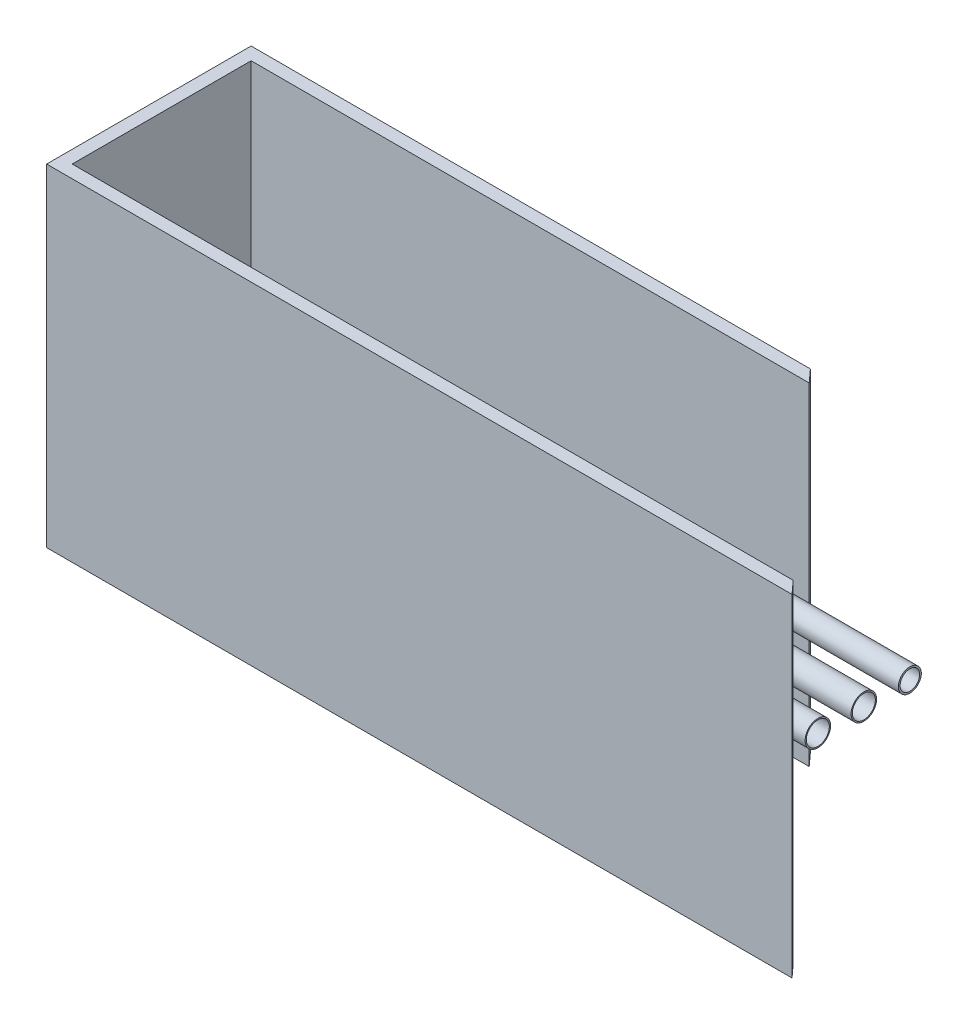
ISO-10303-21;
HEADER;
FILE_DESCRIPTION(('STEP AP214'),'2;1');
FILE_NAME('part.step','',(''),(''),'','','');
FILE_SCHEMA(('AUTOMOTIVE_DESIGN { 1 0 10303 214 1 1 1 1 }'));
ENDSEC;
DATA;
#1=APPLICATION_CONTEXT('core data for automotive mechanical design processes');
#2=APPLICATION_PROTOCOL_DEFINITION('international standard','automotive_design',2000,#1);
#3=PRODUCT_CONTEXT('',#1,'mechanical');
#4=PRODUCT('Part','Part','',(#3));
#5=PRODUCT_RELATED_PRODUCT_CATEGORY('part','',(#4));
#6=PRODUCT_DEFINITION_FORMATION('','',#4);
#7=PRODUCT_DEFINITION_CONTEXT('part definition',#1,'design');
#8=PRODUCT_DEFINITION('design','',#6,#7);
#9=PRODUCT_DEFINITION_SHAPE('','',#8);
#10=(LENGTH_UNIT() NAMED_UNIT(*) SI_UNIT(.MILLI.,.METRE.));
#11=(NAMED_UNIT(*) PLANE_ANGLE_UNIT() SI_UNIT($,.RADIAN.));
#12=(NAMED_UNIT(*) SI_UNIT($,.STERADIAN.) SOLID_ANGLE_UNIT());
#13=UNCERTAINTY_MEASURE_WITH_UNIT(LENGTH_MEASURE(1.E-05),#10,'distance_accuracy_value','');
#14=(GEOMETRIC_REPRESENTATION_CONTEXT(3) GLOBAL_UNCERTAINTY_ASSIGNED_CONTEXT((#13)) GLOBAL_UNIT_ASSIGNED_CONTEXT((#10,
#11,#12)) REPRESENTATION_CONTEXT('',''));
#15=CARTESIAN_POINT('',(0.,0.,0.));
#16=DIRECTION('',(0.,0.,1.));
#17=DIRECTION('',(1.,0.,0.));
#18=AXIS2_PLACEMENT_3D('',#15,#16,#17);
#19=CARTESIAN_POINT('',(-1625.,100.,-350.));
#20=DIRECTION('',(1.,0.,0.));
#21=DIRECTION('',(0.,0.,-1.));
#22=AXIS2_PLACEMENT_3D('',#19,#20,#21);
#23=PLANE('',#22);
#24=CARTESIAN_POINT('',(-1625.,-550.,-10.3175917314073));
#25=DIRECTION('',(1.,0.,0.));
#26=DIRECTION('',(0.,0.,-1.));
#27=AXIS2_PLACEMENT_3D('',#24,#25,#26);
#28=CIRCLE('',#27,49.9275836682249);
#29=CARTESIAN_POINT('',(-1625.,-550.,-60.2451753996322));
#30=VERTEX_POINT('',#29);
#31=EDGE_CURVE('E140',#30,#30,#28,.F.);
#32=ORIENTED_EDGE('',*,*,#31,.T.);
#33=EDGE_LOOP('',(#32));
#34=FACE_BOUND('',#33,.T.);
#35=DIRECTION('',(0.,-1.,0.));
#36=VECTOR('',#35,1.);
#37=CARTESIAN_POINT('',(-1625.,100.,350.));
#38=LINE('',#37,#36);
#39=CARTESIAN_POINT('',(-1625.,100.,350.));
#40=VERTEX_POINT('',#39);
#41=CARTESIAN_POINT('',(-1625.,-1200.,350.));
#42=VERTEX_POINT('',#41);
#43=EDGE_CURVE('E176',#40,#42,#38,.T.);
#44=ORIENTED_EDGE('',*,*,#43,.T.);
#45=DIRECTION('',(0.,0.,1.));
#46=VECTOR('',#45,1.);
#47=CARTESIAN_POINT('',(-1625.,-1200.,-350.));
#48=LINE('',#47,#46);
#49=CARTESIAN_POINT('',(-1625.,-1200.,-350.));
#50=VERTEX_POINT('',#49);
#51=EDGE_CURVE('E150',#50,#42,#48,.T.);
#52=ORIENTED_EDGE('',*,*,#51,.F.);
#53=DIRECTION('',(0.,-1.,0.));
#54=VECTOR('',#53,1.);
#55=CARTESIAN_POINT('',(-1625.,100.,-350.));
#56=LINE('',#55,#54);
#57=CARTESIAN_POINT('',(-1625.,100.,-350.));
#58=VERTEX_POINT('',#57);
#59=EDGE_CURVE('E173',#58,#50,#56,.T.);
#60=ORIENTED_EDGE('',*,*,#59,.F.);
#61=DIRECTION('',(0.,0.,1.));
#62=VECTOR('',#61,1.);
#63=CARTESIAN_POINT('',(-1625.,100.,-350.));
#64=LINE('',#63,#62);
#65=EDGE_CURVE('E166',#58,#40,#64,.T.);
#66=ORIENTED_EDGE('',*,*,#65,.T.);
#67=EDGE_LOOP('',(#44,#52,#60,#66));
#68=FACE_BOUND('',#67,.T.);
#69=CARTESIAN_POINT('',(-1625.,-550.,-190.317591731407));
#70=DIRECTION('',(1.,0.,0.));
#71=DIRECTION('',(0.,0.,-1.));
#72=AXIS2_PLACEMENT_3D('',#69,#70,#71);
#73=CIRCLE('',#72,44.9275836682249);
#74=CARTESIAN_POINT('',(-1625.,-550.,-235.245175399632));
#75=VERTEX_POINT('',#74);
#76=EDGE_CURVE('E192',#75,#75,#73,.F.);
#77=ORIENTED_EDGE('',*,*,#76,.T.);
#78=EDGE_LOOP('',(#77));
#79=FACE_BOUND('',#78,.T.);
#80=CARTESIAN_POINT('',(-1625.,-550.,169.682408268593));
#81=DIRECTION('',(1.,0.,0.));
#82=DIRECTION('',(0.,0.,-1.));
#83=AXIS2_PLACEMENT_3D('',#80,#81,#82);
#84=CIRCLE('',#83,49.9275836682249);
#85=CARTESIAN_POINT('',(-1625.,-550.,119.754824600368));
#86=VERTEX_POINT('',#85);
#87=EDGE_CURVE('E39',#86,#86,#84,.F.);
#88=ORIENTED_EDGE('',*,*,#87,.T.);
#89=EDGE_LOOP('',(#88));
#90=FACE_BOUND('',#89,.T.);
#91=ADVANCED_FACE('F35',(#34,#68,#79,#90),#23,.T.);
#92=CARTESIAN_POINT('',(0.,100.,0.));
#93=DIRECTION('',(0.,1.,0.));
#94=DIRECTION('',(0.,0.,1.));
#95=AXIS2_PLACEMENT_3D('',#92,#93,#94);
#96=PLANE('',#95);
#97=DIRECTION('',(0.673163635467636,0.,0.739493556350558));
#98=VECTOR('',#97,1.);
#99=CARTESIAN_POINT('',(1241.59041612987,100.,400.));
#100=LINE('',#99,#98);
#101=CARTESIAN_POINT('',(513.34754808949,100.,-400.));
#102=VERTEX_POINT('',#101);
#103=CARTESIAN_POINT('',(558.862727342014,100.,-350.));
#104=VERTEX_POINT('',#103);
#105=EDGE_CURVE('E141',#102,#104,#100,.T.);
#106=ORIENTED_EDGE('',*,*,#105,.F.);
#107=DIRECTION('',(-1.,0.,0.));
#108=VECTOR('',#107,1.);
#109=CARTESIAN_POINT('',(-1675.,100.,-400.));
#110=LINE('',#109,#108);
#111=CARTESIAN_POINT('',(-1675.,100.,-400.));
#112=VERTEX_POINT('',#111);
#113=EDGE_CURVE('E178',#102,#112,#110,.T.);
#114=ORIENTED_EDGE('',*,*,#113,.T.);
#115=DIRECTION('',(0.,0.,1.));
#116=VECTOR('',#115,1.);
#117=CARTESIAN_POINT('',(-1675.,100.,-400.));
#118=LINE('',#117,#116);
#119=CARTESIAN_POINT('',(-1675.,100.,400.));
#120=VERTEX_POINT('',#119);
#121=EDGE_CURVE('E180',#112,#120,#118,.T.);
#122=ORIENTED_EDGE('',*,*,#121,.T.);
#123=DIRECTION('',(1.,0.,0.));
#124=VECTOR('',#123,1.);
#125=CARTESIAN_POINT('',(-1675.,100.,400.));
#126=LINE('',#125,#124);
#127=CARTESIAN_POINT('',(1241.59041612987,100.,400.));
#128=VERTEX_POINT('',#127);
#129=EDGE_CURVE('E182',#120,#128,#126,.T.);
#130=ORIENTED_EDGE('',*,*,#129,.T.);
#131=CARTESIAN_POINT('',(1196.07523687734,100.,350.));
#132=VERTEX_POINT('',#131);
#133=EDGE_CURVE('E144',#132,#128,#100,.T.);
#134=ORIENTED_EDGE('',*,*,#133,.F.);
#135=DIRECTION('',(1.,0.,0.));
#136=VECTOR('',#135,1.);
#137=CARTESIAN_POINT('',(-1625.,100.,350.));
#138=LINE('',#137,#136);
#139=EDGE_CURVE('E168',#40,#132,#138,.T.);
#140=ORIENTED_EDGE('',*,*,#139,.F.);
#141=ORIENTED_EDGE('',*,*,#65,.F.);
#142=DIRECTION('',(-1.,0.,0.));
#143=VECTOR('',#142,1.);
#144=CARTESIAN_POINT('',(-1625.,100.,-350.));
#145=LINE('',#144,#143);
#146=EDGE_CURVE('E171',#104,#58,#145,.T.);
#147=ORIENTED_EDGE('',*,*,#146,.F.);
#148=EDGE_LOOP('',(#106,#114,#122,#130,#134,#140,#141,#147));
#149=FACE_BOUND('',#148,.T.);
#150=ADVANCED_FACE('F221',(#149),#96,.T.);
#151=CARTESIAN_POINT('',(-1675.,100.,-400.));
#152=DIRECTION('',(0.,0.,1.));
#153=DIRECTION('',(1.,0.,0.));
#154=AXIS2_PLACEMENT_3D('',#151,#152,#153);
#155=PLANE('',#154);
#156=ORIENTED_EDGE('',*,*,#113,.F.);
#157=DIRECTION('',(0.,1.,0.));
#158=VECTOR('',#157,1.);
#159=CARTESIAN_POINT('',(513.34754808949,-1348.,-400.));
#160=LINE('',#159,#158);
#161=CARTESIAN_POINT('',(513.34754808949,-1200.,-400.));
#162=VERTEX_POINT('',#161);
#163=EDGE_CURVE('E143',#162,#102,#160,.T.);
#164=ORIENTED_EDGE('',*,*,#163,.F.);
#165=DIRECTION('',(-1.,0.,0.));
#166=VECTOR('',#165,1.);
#167=CARTESIAN_POINT('',(-1675.,-1200.,-400.));
#168=LINE('',#167,#166);
#169=CARTESIAN_POINT('',(-1675.,-1200.,-400.));
#170=VERTEX_POINT('',#169);
#171=EDGE_CURVE('E158',#162,#170,#168,.T.);
#172=ORIENTED_EDGE('',*,*,#171,.T.);
#173=DIRECTION('',(0.,-1.,0.));
#174=VECTOR('',#173,1.);
#175=CARTESIAN_POINT('',(-1675.,100.,-400.));
#176=LINE('',#175,#174);
#177=EDGE_CURVE('E187',#112,#170,#176,.T.);
#178=ORIENTED_EDGE('',*,*,#177,.F.);
#179=EDGE_LOOP('',(#156,#164,#172,#178));
#180=FACE_BOUND('',#179,.T.);
#181=ADVANCED_FACE('F37',(#180),#155,.F.);
#182=CARTESIAN_POINT('',(-1675.,100.,-400.));
#183=DIRECTION('',(1.,0.,0.));
#184=DIRECTION('',(0.,0.,-1.));
#185=AXIS2_PLACEMENT_3D('',#182,#183,#184);
#186=PLANE('',#185);
#187=ORIENTED_EDGE('',*,*,#177,.T.);
#188=DIRECTION('',(0.,0.,1.));
#189=VECTOR('',#188,1.);
#190=CARTESIAN_POINT('',(-1675.,-1200.,-400.));
#191=LINE('',#190,#189);
#192=CARTESIAN_POINT('',(-1675.,-1200.,400.));
#193=VERTEX_POINT('',#192);
#194=EDGE_CURVE('E160',#170,#193,#191,.T.);
#195=ORIENTED_EDGE('',*,*,#194,.T.);
#196=DIRECTION('',(0.,-1.,0.));
#197=VECTOR('',#196,1.);
#198=CARTESIAN_POINT('',(-1675.,100.,400.));
#199=LINE('',#198,#197);
#200=EDGE_CURVE('E185',#120,#193,#199,.T.);
#201=ORIENTED_EDGE('',*,*,#200,.F.);
#202=ORIENTED_EDGE('',*,*,#121,.F.);
#203=EDGE_LOOP('',(#187,#195,#201,#202));
#204=FACE_BOUND('',#203,.T.);
#205=ADVANCED_FACE('F280',(#204),#186,.F.);
#206=CARTESIAN_POINT('',(-1675.,100.,400.));
#207=DIRECTION('',(0.,0.,-1.));
#208=DIRECTION('',(-1.,0.,0.));
#209=AXIS2_PLACEMENT_3D('',#206,#207,#208);
#210=PLANE('',#209);
#211=DIRECTION('',(1.,0.,0.));
#212=VECTOR('',#211,1.);
#213=CARTESIAN_POINT('',(-1675.,-1200.,400.));
#214=LINE('',#213,#212);
#215=CARTESIAN_POINT('',(1241.59041612987,-1200.,400.));
#216=VERTEX_POINT('',#215);
#217=EDGE_CURVE('E163',#193,#216,#214,.T.);
#218=ORIENTED_EDGE('',*,*,#217,.T.);
#219=DIRECTION('',(0.,1.,0.));
#220=VECTOR('',#219,1.);
#221=CARTESIAN_POINT('',(1241.59041612987,-1348.,400.));
#222=LINE('',#221,#220);
#223=EDGE_CURVE('E52',#216,#128,#222,.T.);
#224=ORIENTED_EDGE('',*,*,#223,.T.);
#225=ORIENTED_EDGE('',*,*,#129,.F.);
#226=ORIENTED_EDGE('',*,*,#200,.T.);
#227=EDGE_LOOP('',(#218,#224,#225,#226));
#228=FACE_BOUND('',#227,.T.);
#229=ADVANCED_FACE('F275',(#228),#210,.F.);
#230=CARTESIAN_POINT('',(-1625.,100.,350.));
#231=DIRECTION('',(0.,0.,-1.));
#232=DIRECTION('',(-1.,0.,0.));
#233=AXIS2_PLACEMENT_3D('',#230,#231,#232);
#234=PLANE('',#233);
#235=DIRECTION('',(0.,1.,0.));
#236=VECTOR('',#235,1.);
#237=CARTESIAN_POINT('',(1196.07523687734,100.,350.));
#238=LINE('',#237,#236);
#239=CARTESIAN_POINT('',(1196.07523687734,-1200.,350.));
#240=VERTEX_POINT('',#239);
#241=EDGE_CURVE('E146',#240,#132,#238,.T.);
#242=ORIENTED_EDGE('',*,*,#241,.F.);
#243=DIRECTION('',(1.,0.,0.));
#244=VECTOR('',#243,1.);
#245=CARTESIAN_POINT('',(-1625.,-1200.,350.));
#246=LINE('',#245,#244);
#247=EDGE_CURVE('E153',#42,#240,#246,.T.);
#248=ORIENTED_EDGE('',*,*,#247,.F.);
#249=ORIENTED_EDGE('',*,*,#43,.F.);
#250=ORIENTED_EDGE('',*,*,#139,.T.);
#251=EDGE_LOOP('',(#242,#248,#249,#250));
#252=FACE_BOUND('',#251,.T.);
#253=ADVANCED_FACE('F272',(#252),#234,.T.);
#254=CARTESIAN_POINT('',(-1625.,100.,-350.));
#255=DIRECTION('',(0.,0.,1.));
#256=DIRECTION('',(1.,0.,0.));
#257=AXIS2_PLACEMENT_3D('',#254,#255,#256);
#258=PLANE('',#257);
#259=DIRECTION('',(0.,-1.,0.));
#260=VECTOR('',#259,1.);
#261=CARTESIAN_POINT('',(558.862727342014,100.,-350.));
#262=LINE('',#261,#260);
#263=CARTESIAN_POINT('',(558.862727342013,-1200.,-350.));
#264=VERTEX_POINT('',#263);
#265=EDGE_CURVE('E60',#104,#264,#262,.T.);
#266=ORIENTED_EDGE('',*,*,#265,.F.);
#267=ORIENTED_EDGE('',*,*,#146,.T.);
#268=ORIENTED_EDGE('',*,*,#59,.T.);
#269=DIRECTION('',(-1.,0.,0.));
#270=VECTOR('',#269,1.);
#271=CARTESIAN_POINT('',(-1625.,-1200.,-350.));
#272=LINE('',#271,#270);
#273=EDGE_CURVE('E156',#264,#50,#272,.T.);
#274=ORIENTED_EDGE('',*,*,#273,.F.);
#275=EDGE_LOOP('',(#266,#267,#268,#274));
#276=FACE_BOUND('',#275,.T.);
#277=ADVANCED_FACE('F269',(#276),#258,.T.);
#278=CARTESIAN_POINT('',(0.,-1200.,0.));
#279=DIRECTION('',(0.,1.,0.));
#280=DIRECTION('',(0.,0.,1.));
#281=AXIS2_PLACEMENT_3D('',#278,#279,#280);
#282=PLANE('',#281);
#283=ORIENTED_EDGE('',*,*,#171,.F.);
#284=DIRECTION('',(0.673163635467636,0.,0.739493556350558));
#285=VECTOR('',#284,1.);
#286=CARTESIAN_POINT('',(479.844544542555,-1200.,-436.804209163999));
#287=LINE('',#286,#285);
#288=EDGE_CURVE('E11',#162,#264,#287,.T.);
#289=ORIENTED_EDGE('',*,*,#288,.T.);
#290=ORIENTED_EDGE('',*,*,#273,.T.);
#291=ORIENTED_EDGE('',*,*,#51,.T.);
#292=ORIENTED_EDGE('',*,*,#247,.T.);
#293=EDGE_CURVE('E44',#240,#216,#287,.T.);
#294=ORIENTED_EDGE('',*,*,#293,.T.);
#295=ORIENTED_EDGE('',*,*,#217,.F.);
#296=ORIENTED_EDGE('',*,*,#194,.F.);
#297=EDGE_LOOP('',(#283,#289,#290,#291,#292,#294,#295,#296));
#298=FACE_BOUND('',#297,.T.);
#299=ADVANCED_FACE('F266',(#298),#282,.F.);
#300=CARTESIAN_POINT('',(1241.59041612987,-1348.,400.));
#301=DIRECTION('',(-0.739493556350558,0.,0.673163635467636));
#302=DIRECTION('',(0.673163635467636,0.,0.739493556350558));
#303=AXIS2_PLACEMENT_3D('',#300,#301,#302);
#304=PLANE('',#303);
#305=ORIENTED_EDGE('',*,*,#241,.T.);
#306=ORIENTED_EDGE('',*,*,#133,.T.);
#307=ORIENTED_EDGE('',*,*,#223,.F.);
#308=ORIENTED_EDGE('',*,*,#293,.F.);
#309=EDGE_LOOP('',(#305,#306,#307,#308));
#310=FACE_BOUND('',#309,.T.);
#311=ADVANCED_FACE('F260',(#310),#304,.F.);
#312=ORIENTED_EDGE('',*,*,#265,.T.);
#313=ORIENTED_EDGE('',*,*,#288,.F.);
#314=ORIENTED_EDGE('',*,*,#163,.T.);
#315=ORIENTED_EDGE('',*,*,#105,.T.);
#316=EDGE_LOOP('',(#312,#313,#314,#315));
#317=FACE_BOUND('',#316,.T.);
#318=ADVANCED_FACE('F247',(#317),#304,.F.);
#319=CARTESIAN_POINT('',(-1675.,-550.,-190.317591731407));
#320=DIRECTION('',(1.,0.,0.));
#321=DIRECTION('',(0.,1.,0.));
#322=AXIS2_PLACEMENT_3D('',#319,#320,#321);
#323=CYLINDRICAL_SURFACE('',#322,44.9275836682249);
#324=ORIENTED_EDGE('',*,*,#76,.F.);
#325=EDGE_LOOP('',(#324));
#326=FACE_BOUND('',#325,.T.);
#327=CARTESIAN_POINT('',(1112.34168809318,-550.000000000011,-190.317591731407));
#328=DIRECTION('',(-1.,0.,0.));
#329=DIRECTION('',(0.,0.,1.));
#330=AXIS2_PLACEMENT_3D('',#327,#328,#329);
#331=CIRCLE('',#330,44.9275836682249);
#332=CARTESIAN_POINT('',(1112.34168809318,-550.000000000011,-145.390008063182));
#333=VERTEX_POINT('',#332);
#334=EDGE_CURVE('E137',#333,#333,#331,.T.);
#335=ORIENTED_EDGE('',*,*,#334,.T.);
#336=EDGE_LOOP('',(#335));
#337=FACE_BOUND('',#336,.T.);
#338=ADVANCED_FACE('F238',(#326,#337),#323,.T.);
#339=CARTESIAN_POINT('',(1112.34168809318,-550.000000000011,-190.317591731407));
#340=DIRECTION('',(-1.,0.,0.));
#341=DIRECTION('',(0.,0.,1.));
#342=AXIS2_PLACEMENT_3D('',#339,#340,#341);
#343=PLANE('',#342);
#344=CARTESIAN_POINT('',(1112.34168809318,-550.000000000011,-190.317591731407));
#345=DIRECTION('',(-1.,0.,0.));
#346=DIRECTION('',(0.,0.,1.));
#347=AXIS2_PLACEMENT_3D('',#344,#345,#346);
#348=CIRCLE('',#347,38.1);
#349=CARTESIAN_POINT('',(1112.34168809318,-550.000000000011,-152.217591731407));
#350=VERTEX_POINT('',#349);
#351=EDGE_CURVE('E134',#350,#350,#348,.F.);
#352=ORIENTED_EDGE('',*,*,#351,.F.);
#353=EDGE_LOOP('',(#352));
#354=FACE_BOUND('',#353,.T.);
#355=ORIENTED_EDGE('',*,*,#334,.F.);
#356=EDGE_LOOP('',(#355));
#357=FACE_BOUND('',#356,.T.);
#358=ADVANCED_FACE('F244',(#354,#357),#343,.F.);
#359=CARTESIAN_POINT('',(-1675.,-550.,-190.317591731407));
#360=DIRECTION('',(1.,0.,0.));
#361=DIRECTION('',(0.,1.,0.));
#362=AXIS2_PLACEMENT_3D('',#359,#360,#361);
#363=CYLINDRICAL_SURFACE('',#362,38.1);
#364=CARTESIAN_POINT('',(-1625.,-550.,-190.317591731407));
#365=DIRECTION('',(1.,0.,0.));
#366=DIRECTION('',(0.,0.,-1.));
#367=AXIS2_PLACEMENT_3D('',#364,#365,#366);
#368=CIRCLE('',#367,38.1);
#369=CARTESIAN_POINT('',(-1625.,-550.,-228.417591731407));
#370=VERTEX_POINT('',#369);
#371=EDGE_CURVE('E136',#370,#370,#368,.T.);
#372=ORIENTED_EDGE('',*,*,#371,.F.);
#373=EDGE_LOOP('',(#372));
#374=FACE_BOUND('',#373,.T.);
#375=ORIENTED_EDGE('',*,*,#351,.T.);
#376=EDGE_LOOP('',(#375));
#377=FACE_BOUND('',#376,.T.);
#378=ADVANCED_FACE('F236',(#374,#377),#363,.F.);
#379=ORIENTED_EDGE('',*,*,#371,.T.);
#380=EDGE_LOOP('',(#379));
#381=FACE_BOUND('',#380,.T.);
#382=ADVANCED_FACE('F206',(#381),#23,.T.);
#383=CARTESIAN_POINT('',(-1675.,-550.,-10.3175917314073));
#384=DIRECTION('',(1.,0.,0.));
#385=DIRECTION('',(0.,1.,0.));
#386=AXIS2_PLACEMENT_3D('',#383,#384,#385);
#387=CYLINDRICAL_SURFACE('',#386,49.9275836682249);
#388=ORIENTED_EDGE('',*,*,#31,.F.);
#389=EDGE_LOOP('',(#388));
#390=FACE_BOUND('',#389,.T.);
#391=CARTESIAN_POINT('',(1112.34168809318,-550.000000000011,-10.3175917314073));
#392=DIRECTION('',(-1.,0.,0.));
#393=DIRECTION('',(0.,0.,1.));
#394=AXIS2_PLACEMENT_3D('',#391,#392,#393);
#395=CIRCLE('',#394,49.9275836682249);
#396=CARTESIAN_POINT('',(1112.34168809318,-550.000000000011,39.6099919368177));
#397=VERTEX_POINT('',#396);
#398=EDGE_CURVE('E131',#397,#397,#395,.T.);
#399=ORIENTED_EDGE('',*,*,#398,.T.);
#400=EDGE_LOOP('',(#399));
#401=FACE_BOUND('',#400,.T.);
#402=ADVANCED_FACE('F202',(#390,#401),#387,.T.);
#403=CARTESIAN_POINT('',(1112.34168809318,-550.000000000011,-10.3175917314073));
#404=DIRECTION('',(-1.,0.,0.));
#405=DIRECTION('',(0.,0.,1.));
#406=AXIS2_PLACEMENT_3D('',#403,#404,#405);
#407=PLANE('',#406);
#408=CARTESIAN_POINT('',(1112.34168809318,-550.000000000011,-10.3175917314073));
#409=DIRECTION('',(-1.,0.,0.));
#410=DIRECTION('',(0.,0.,1.));
#411=AXIS2_PLACEMENT_3D('',#408,#409,#410);
#412=CIRCLE('',#411,44.9275836682249);
#413=CARTESIAN_POINT('',(1112.34168809318,-550.000000000011,34.6099919368177));
#414=VERTEX_POINT('',#413);
#415=EDGE_CURVE('E128',#414,#414,#412,.F.);
#416=ORIENTED_EDGE('',*,*,#415,.F.);
#417=EDGE_LOOP('',(#416));
#418=FACE_BOUND('',#417,.T.);
#419=ORIENTED_EDGE('',*,*,#398,.F.);
#420=EDGE_LOOP('',(#419));
#421=FACE_BOUND('',#420,.T.);
#422=ADVANCED_FACE('F205',(#418,#421),#407,.F.);
#423=CARTESIAN_POINT('',(-1675.,-550.,-10.3175917314073));
#424=DIRECTION('',(1.,0.,0.));
#425=DIRECTION('',(0.,1.,0.));
#426=AXIS2_PLACEMENT_3D('',#423,#424,#425);
#427=CYLINDRICAL_SURFACE('',#426,44.9275836682249);
#428=CARTESIAN_POINT('',(-1625.,-550.,-10.3175917314073));
#429=DIRECTION('',(1.,0.,0.));
#430=DIRECTION('',(0.,0.,-1.));
#431=AXIS2_PLACEMENT_3D('',#428,#429,#430);
#432=CIRCLE('',#431,44.9275836682249);
#433=CARTESIAN_POINT('',(-1625.,-550.,-55.2451753996322));
#434=VERTEX_POINT('',#433);
#435=EDGE_CURVE('E130',#434,#434,#432,.T.);
#436=ORIENTED_EDGE('',*,*,#435,.F.);
#437=EDGE_LOOP('',(#436));
#438=FACE_BOUND('',#437,.T.);
#439=ORIENTED_EDGE('',*,*,#415,.T.);
#440=EDGE_LOOP('',(#439));
#441=FACE_BOUND('',#440,.T.);
#442=ADVANCED_FACE('F211',(#438,#441),#427,.F.);
#443=ORIENTED_EDGE('',*,*,#435,.T.);
#444=EDGE_LOOP('',(#443));
#445=FACE_BOUND('',#444,.T.);
#446=ADVANCED_FACE('F208',(#445),#23,.T.);
#447=CARTESIAN_POINT('',(-1675.,-550.,169.682408268593));
#448=DIRECTION('',(1.,0.,0.));
#449=DIRECTION('',(0.,1.,0.));
#450=AXIS2_PLACEMENT_3D('',#447,#448,#449);
#451=CYLINDRICAL_SURFACE('',#450,49.9275836682249);
#452=ORIENTED_EDGE('',*,*,#87,.F.);
#453=EDGE_LOOP('',(#452));
#454=FACE_BOUND('',#453,.T.);
#455=CARTESIAN_POINT('',(1112.34168809318,-550.000000000011,169.682408268593));
#456=DIRECTION('',(-1.,0.,0.));
#457=DIRECTION('',(0.,0.,1.));
#458=AXIS2_PLACEMENT_3D('',#455,#456,#457);
#459=CIRCLE('',#458,49.9275836682249);
#460=CARTESIAN_POINT('',(1112.34168809318,-550.000000000011,219.609991936818));
#461=VERTEX_POINT('',#460);
#462=EDGE_CURVE('E122',#461,#461,#459,.T.);
#463=ORIENTED_EDGE('',*,*,#462,.T.);
#464=EDGE_LOOP('',(#463));
#465=FACE_BOUND('',#464,.T.);
#466=ADVANCED_FACE('F234',(#454,#465),#451,.T.);
#467=CARTESIAN_POINT('',(1112.34168809318,-550.000000000011,169.682408268593));
#468=DIRECTION('',(-1.,0.,0.));
#469=DIRECTION('',(0.,0.,1.));
#470=AXIS2_PLACEMENT_3D('',#467,#468,#469);
#471=PLANE('',#470);
#472=CARTESIAN_POINT('',(1112.34168809318,-550.000000000011,169.682408268593));
#473=DIRECTION('',(-1.,0.,0.));
#474=DIRECTION('',(0.,0.,1.));
#475=AXIS2_PLACEMENT_3D('',#472,#473,#474);
#476=CIRCLE('',#475,44.9275836682249);
#477=CARTESIAN_POINT('',(1112.34168809318,-550.000000000011,214.609991936818));
#478=VERTEX_POINT('',#477);
#479=EDGE_CURVE('E118',#478,#478,#476,.F.);
#480=ORIENTED_EDGE('',*,*,#479,.F.);
#481=EDGE_LOOP('',(#480));
#482=FACE_BOUND('',#481,.T.);
#483=ORIENTED_EDGE('',*,*,#462,.F.);
#484=EDGE_LOOP('',(#483));
#485=FACE_BOUND('',#484,.T.);
#486=ADVANCED_FACE('F340',(#482,#485),#471,.F.);
#487=CARTESIAN_POINT('',(-1675.,-550.,169.682408268593));
#488=DIRECTION('',(1.,0.,0.));
#489=DIRECTION('',(0.,1.,0.));
#490=AXIS2_PLACEMENT_3D('',#487,#488,#489);
#491=CYLINDRICAL_SURFACE('',#490,44.9275836682249);
#492=CARTESIAN_POINT('',(-1625.,-550.,169.682408268593));
#493=DIRECTION('',(1.,0.,0.));
#494=DIRECTION('',(0.,0.,-1.));
#495=AXIS2_PLACEMENT_3D('',#492,#493,#494);
#496=CIRCLE('',#495,44.9275836682249);
#497=CARTESIAN_POINT('',(-1625.,-550.,124.754824600368));
#498=VERTEX_POINT('',#497);
#499=EDGE_CURVE('E121',#498,#498,#496,.T.);
#500=ORIENTED_EDGE('',*,*,#499,.F.);
#501=EDGE_LOOP('',(#500));
#502=FACE_BOUND('',#501,.T.);
#503=ORIENTED_EDGE('',*,*,#479,.T.);
#504=EDGE_LOOP('',(#503));
#505=FACE_BOUND('',#504,.T.);
#506=ADVANCED_FACE('F119',(#502,#505),#491,.F.);
#507=ORIENTED_EDGE('',*,*,#499,.T.);
#508=EDGE_LOOP('',(#507));
#509=FACE_BOUND('',#508,.T.);
#510=ADVANCED_FACE('F223',(#509),#23,.T.);
#511=CLOSED_SHELL('',(#91,#150,#181,#205,#229,#253,#277,#299,#311,#318,#338,#358,#378,#382,#402,
#422,#442,#446,#466,#486,#506,#510));
#512=MANIFOLD_SOLID_BREP('B2',#511);
#513=ADVANCED_BREP_SHAPE_REPRESENTATION('',(#18,#512),#14);
#514=SHAPE_DEFINITION_REPRESENTATION(#9,#513);
ENDSEC;
END-ISO-10303-21;
